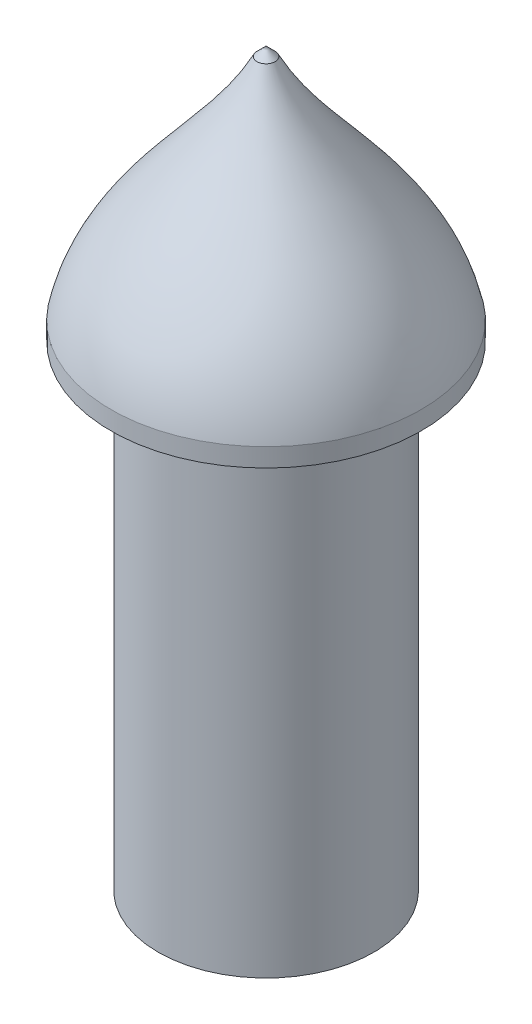
ISO-10303-21;
HEADER;
FILE_DESCRIPTION(('STEP AP214'),'2;1');
FILE_NAME('part.step','',(''),(''),'','','');
FILE_SCHEMA(('AUTOMOTIVE_DESIGN { 1 0 10303 214 1 1 1 1 }'));
ENDSEC;
DATA;
#1=APPLICATION_CONTEXT('core data for automotive mechanical design processes');
#2=APPLICATION_PROTOCOL_DEFINITION('international standard','automotive_design',2000,#1);
#3=PRODUCT_CONTEXT('',#1,'mechanical');
#4=PRODUCT('Part','Part','',(#3));
#5=PRODUCT_RELATED_PRODUCT_CATEGORY('part','',(#4));
#6=PRODUCT_DEFINITION_FORMATION('','',#4);
#7=PRODUCT_DEFINITION_CONTEXT('part definition',#1,'design');
#8=PRODUCT_DEFINITION('design','',#6,#7);
#9=PRODUCT_DEFINITION_SHAPE('','',#8);
#10=(LENGTH_UNIT() NAMED_UNIT(*) SI_UNIT(.MILLI.,.METRE.));
#11=(NAMED_UNIT(*) PLANE_ANGLE_UNIT() SI_UNIT($,.RADIAN.));
#12=(NAMED_UNIT(*) SI_UNIT($,.STERADIAN.) SOLID_ANGLE_UNIT());
#13=UNCERTAINTY_MEASURE_WITH_UNIT(LENGTH_MEASURE(1.E-05),#10,'distance_accuracy_value','');
#14=(GEOMETRIC_REPRESENTATION_CONTEXT(3) GLOBAL_UNCERTAINTY_ASSIGNED_CONTEXT((#13)) GLOBAL_UNIT_ASSIGNED_CONTEXT((#10,
#11,#12)) REPRESENTATION_CONTEXT('',''));
#15=CARTESIAN_POINT('',(0.,0.,0.));
#16=DIRECTION('',(0.,0.,1.));
#17=DIRECTION('',(1.,0.,0.));
#18=AXIS2_PLACEMENT_3D('',#15,#16,#17);
#19=CARTESIAN_POINT('',(-2.,0.,0.));
#20=DIRECTION('',(0.,1.,0.));
#21=DIRECTION('',(0.,0.,1.));
#22=AXIS2_PLACEMENT_3D('',#19,#20,#21);
#23=PLANE('',#22);
#24=CARTESIAN_POINT('',(0.,0.,0.));
#25=DIRECTION('',(0.,1.,0.));
#26=DIRECTION('',(0.,0.,1.));
#27=AXIS2_PLACEMENT_3D('',#24,#25,#26);
#28=CIRCLE('',#27,3.45);
#29=CARTESIAN_POINT('',(0.,0.,3.45));
#30=VERTEX_POINT('',#29);
#31=EDGE_CURVE('E11',#30,#30,#28,.T.);
#32=ORIENTED_EDGE('',*,*,#31,.T.);
#33=EDGE_LOOP('',(#32));
#34=FACE_BOUND('',#33,.T.);
#35=CARTESIAN_POINT('',(0.,0.,0.));
#36=DIRECTION('',(0.,-1.,0.));
#37=DIRECTION('',(0.,0.,-1.));
#38=AXIS2_PLACEMENT_3D('',#35,#36,#37);
#39=CIRCLE('',#38,4.24433157335061);
#40=CARTESIAN_POINT('',(0.,0.,-4.24433157335061));
#41=VERTEX_POINT('',#40);
#42=EDGE_CURVE('E57',#41,#41,#39,.T.);
#43=ORIENTED_EDGE('',*,*,#42,.T.);
#44=EDGE_LOOP('',(#43));
#45=FACE_BOUND('',#44,.T.);
#46=ADVANCED_FACE('F33',(#34,#45),#23,.F.);
#47=CARTESIAN_POINT('',(0.,7.,0.));
#48=DIRECTION('',(0.,-1.,0.));
#49=DIRECTION('',(0.,0.,-1.));
#50=AXIS2_PLACEMENT_3D('',#47,#48,#49);
#51=CONICAL_SURFACE('',#50,0.,0.785398163397438);
#52=CARTESIAN_POINT('',(0.,6.75257649370923,0.));
#53=DIRECTION('',(0.,-1.,0.));
#54=DIRECTION('',(0.,0.,-1.));
#55=AXIS2_PLACEMENT_3D('',#52,#53,#54);
#56=CIRCLE('',#55,0.247423506290761);
#57=CARTESIAN_POINT('',(0.,6.75257649370923,-0.247423506290761));
#58=VERTEX_POINT('',#57);
#59=EDGE_CURVE('E107',#58,#58,#56,.T.);
#60=ORIENTED_EDGE('',*,*,#59,.F.);
#61=EDGE_LOOP('',(#60));
#62=FACE_BOUND('',#61,.T.);
#63=CARTESIAN_POINT('',(0.,7.,0.));
#64=VERTEX_POINT('',#63);
#65=VERTEX_LOOP('',#64);
#66=FACE_BOUND('',#65,.T.);
#67=ADVANCED_FACE('F97',(#62,#66),#51,.T.);
#68=CARTESIAN_POINT('',(-0.247423506290761,6.75257649370924,0.));
#69=CARTESIAN_POINT('',(-1.37731233628629,4.51509097975712,0.));
#70=CARTESIAN_POINT('',(-3.6972749551022,3.08189891885917,0.));
#71=CARTESIAN_POINT('',(-4.24433157335061,0.506327417075365,0.));
#72=B_SPLINE_CURVE_WITH_KNOTS('',3,(#68,#69,#70,#71),.UNSPECIFIED.,.F.,.F.,(4,4),(0.,1.),.UNSPECIFIED.);
#73=CARTESIAN_POINT('',(0.,-2.,0.));
#74=DIRECTION('',(0.,-1.,0.));
#75=AXIS1_PLACEMENT('',#73,#74);
#76=SURFACE_OF_REVOLUTION('',#72,#75);
#77=CARTESIAN_POINT('',(0.,0.506327417075365,0.));
#78=DIRECTION('',(0.,-1.,0.));
#79=DIRECTION('',(0.,0.,-1.));
#80=AXIS2_PLACEMENT_3D('',#77,#78,#79);
#81=CIRCLE('',#80,4.24433157335061);
#82=CARTESIAN_POINT('',(0.,0.506327417075365,-4.24433157335061));
#83=VERTEX_POINT('',#82);
#84=EDGE_CURVE('E61',#83,#83,#81,.T.);
#85=ORIENTED_EDGE('',*,*,#84,.F.);
#86=EDGE_LOOP('',(#85));
#87=FACE_BOUND('',#86,.T.);
#88=ORIENTED_EDGE('',*,*,#59,.T.);
#89=EDGE_LOOP('',(#88));
#90=FACE_BOUND('',#89,.T.);
#91=ADVANCED_FACE('F94',(#87,#90),#76,.T.);
#92=CARTESIAN_POINT('',(0.,-2.,0.));
#93=DIRECTION('',(0.,-1.,0.));
#94=DIRECTION('',(0.,0.,-1.));
#95=AXIS2_PLACEMENT_3D('',#92,#93,#94);
#96=CYLINDRICAL_SURFACE('',#95,4.24433157335061);
#97=ORIENTED_EDGE('',*,*,#42,.F.);
#98=EDGE_LOOP('',(#97));
#99=FACE_BOUND('',#98,.T.);
#100=ORIENTED_EDGE('',*,*,#84,.T.);
#101=EDGE_LOOP('',(#100));
#102=FACE_BOUND('',#101,.T.);
#103=ADVANCED_FACE('F90',(#99,#102),#96,.T.);
#104=CARTESIAN_POINT('',(0.,-13.,0.));
#105=DIRECTION('',(0.,-1.,0.));
#106=DIRECTION('',(0.,0.,-1.));
#107=AXIS2_PLACEMENT_3D('',#104,#105,#106);
#108=PLANE('',#107);
#109=CARTESIAN_POINT('',(0.,-13.,0.));
#110=DIRECTION('',(0.,-1.,0.));
#111=DIRECTION('',(0.,0.,-1.));
#112=AXIS2_PLACEMENT_3D('',#109,#110,#111);
#113=CIRCLE('',#112,2.95);
#114=CARTESIAN_POINT('',(0.,-13.,2.95));
#115=VERTEX_POINT('',#114);
#116=EDGE_CURVE('E64',#115,#115,#113,.T.);
#117=ORIENTED_EDGE('',*,*,#116,.T.);
#118=EDGE_LOOP('',(#117));
#119=FACE_BOUND('',#118,.T.);
#120=CARTESIAN_POINT('',(0.,-13.,0.));
#121=DIRECTION('',(0.,-1.,0.));
#122=DIRECTION('',(0.,0.,-1.));
#123=AXIS2_PLACEMENT_3D('',#120,#121,#122);
#124=CIRCLE('',#123,2.1);
#125=CARTESIAN_POINT('',(0.,-13.,2.1));
#126=VERTEX_POINT('',#125);
#127=EDGE_CURVE('E207',#126,#126,#124,.T.);
#128=ORIENTED_EDGE('',*,*,#127,.F.);
#129=EDGE_LOOP('',(#128));
#130=FACE_BOUND('',#129,.T.);
#131=ADVANCED_FACE('F93',(#119,#130),#108,.T.);
#132=CARTESIAN_POINT('',(0.,-13.,0.));
#133=DIRECTION('',(0.,1.,0.));
#134=DIRECTION('',(0.,0.,1.));
#135=AXIS2_PLACEMENT_3D('',#132,#133,#134);
#136=CYLINDRICAL_SURFACE('',#135,2.95);
#137=CARTESIAN_POINT('',(0.,-0.5,0.));
#138=DIRECTION('',(0.,1.,0.));
#139=DIRECTION('',(0.,0.,1.));
#140=AXIS2_PLACEMENT_3D('',#137,#138,#139);
#141=CIRCLE('',#140,2.95);
#142=CARTESIAN_POINT('',(0.,-0.5,2.95));
#143=VERTEX_POINT('',#142);
#144=EDGE_CURVE('E41',#143,#143,#141,.F.);
#145=CARTESIAN_POINT('',(0.,-0.5,2.95));
#146=CARTESIAN_POINT('',(0.,-0.630208333333334,2.95));
#147=CARTESIAN_POINT('',(0.,-0.760416666666667,2.95));
#148=CARTESIAN_POINT('',(0.,-1.02083333333333,2.95));
#149=CARTESIAN_POINT('',(0.,-1.15104166666667,2.95));
#150=CARTESIAN_POINT('',(0.,-1.41145833333333,2.95));
#151=CARTESIAN_POINT('',(0.,-1.54166666666667,2.95));
#152=CARTESIAN_POINT('',(0.,-1.80208333333333,2.95));
#153=CARTESIAN_POINT('',(0.,-1.93229166666667,2.95));
#154=CARTESIAN_POINT('',(0.,-2.19270833333333,2.95));
#155=CARTESIAN_POINT('',(0.,-2.32291666666667,2.95));
#156=CARTESIAN_POINT('',(0.,-2.58333333333333,2.95));
#157=CARTESIAN_POINT('',(0.,-2.71354166666667,2.95));
#158=CARTESIAN_POINT('',(0.,-2.97395833333333,2.95));
#159=CARTESIAN_POINT('',(0.,-3.10416666666667,2.95));
#160=CARTESIAN_POINT('',(0.,-3.36458333333333,2.95));
#161=CARTESIAN_POINT('',(0.,-3.49479166666667,2.95));
#162=CARTESIAN_POINT('',(0.,-3.75520833333333,2.95));
#163=CARTESIAN_POINT('',(0.,-3.88541666666667,2.95));
#164=CARTESIAN_POINT('',(0.,-4.14583333333333,2.95));
#165=CARTESIAN_POINT('',(0.,-4.27604166666667,2.95));
#166=CARTESIAN_POINT('',(0.,-4.53645833333333,2.95));
#167=CARTESIAN_POINT('',(0.,-4.66666666666667,2.95));
#168=CARTESIAN_POINT('',(0.,-4.92708333333333,2.95));
#169=CARTESIAN_POINT('',(0.,-5.05729166666667,2.95));
#170=CARTESIAN_POINT('',(0.,-5.31770833333333,2.95));
#171=CARTESIAN_POINT('',(0.,-5.44791666666667,2.95));
#172=CARTESIAN_POINT('',(0.,-5.70833333333333,2.95));
#173=CARTESIAN_POINT('',(0.,-5.83854166666667,2.95));
#174=CARTESIAN_POINT('',(0.,-6.09895833333333,2.95));
#175=CARTESIAN_POINT('',(0.,-6.22916666666667,2.95));
#176=CARTESIAN_POINT('',(0.,-6.48958333333333,2.95));
#177=CARTESIAN_POINT('',(0.,-6.61979166666667,2.95));
#178=CARTESIAN_POINT('',(0.,-6.88020833333333,2.95));
#179=CARTESIAN_POINT('',(0.,-7.01041666666667,2.95));
#180=CARTESIAN_POINT('',(0.,-7.27083333333333,2.95));
#181=CARTESIAN_POINT('',(0.,-7.40104166666667,2.95));
#182=CARTESIAN_POINT('',(0.,-7.66145833333333,2.95));
#183=CARTESIAN_POINT('',(0.,-7.79166666666667,2.95));
#184=CARTESIAN_POINT('',(0.,-8.05208333333333,2.95));
#185=CARTESIAN_POINT('',(0.,-8.18229166666667,2.95));
#186=CARTESIAN_POINT('',(0.,-8.44270833333333,2.95));
#187=CARTESIAN_POINT('',(0.,-8.57291666666667,2.95));
#188=CARTESIAN_POINT('',(0.,-8.83333333333333,2.95));
#189=CARTESIAN_POINT('',(0.,-8.96354166666667,2.95));
#190=CARTESIAN_POINT('',(0.,-9.22395833333333,2.95));
#191=CARTESIAN_POINT('',(0.,-9.35416666666667,2.95));
#192=CARTESIAN_POINT('',(0.,-9.61458333333333,2.95));
#193=CARTESIAN_POINT('',(0.,-9.74479166666667,2.95));
#194=CARTESIAN_POINT('',(0.,-10.0052083333333,2.95));
#195=CARTESIAN_POINT('',(0.,-10.1354166666667,2.95));
#196=CARTESIAN_POINT('',(0.,-10.3958333333333,2.95));
#197=CARTESIAN_POINT('',(0.,-10.5260416666667,2.95));
#198=CARTESIAN_POINT('',(0.,-10.7864583333333,2.95));
#199=CARTESIAN_POINT('',(0.,-10.9166666666667,2.95));
#200=CARTESIAN_POINT('',(0.,-11.1770833333333,2.95));
#201=CARTESIAN_POINT('',(0.,-11.3072916666667,2.95));
#202=CARTESIAN_POINT('',(0.,-11.5677083333333,2.95));
#203=CARTESIAN_POINT('',(0.,-11.6979166666667,2.95));
#204=CARTESIAN_POINT('',(0.,-11.9583333333333,2.95));
#205=CARTESIAN_POINT('',(0.,-12.0885416666667,2.95));
#206=CARTESIAN_POINT('',(0.,-12.3489583333333,2.95));
#207=CARTESIAN_POINT('',(0.,-12.4791666666667,2.95));
#208=CARTESIAN_POINT('',(0.,-12.7395833333333,2.95));
#209=CARTESIAN_POINT('',(0.,-12.8697916666667,2.95));
#210=CARTESIAN_POINT('',(0.,-13.,2.95));
#211=B_SPLINE_CURVE_WITH_KNOTS('',3,(#145,#146,#147,#148,#149,#150,#151,#152,#153,#154,#155,
#156,#157,#158,#159,#160,#161,#162,#163,#164,#165,#166,#167,#168,#169,#170,#171,#172,#173,#174,
#175,#176,#177,#178,#179,#180,#181,#182,#183,#184,#185,#186,#187,#188,#189,#190,#191,#192,#193,
#194,#195,#196,#197,#198,#199,#200,#201,#202,#203,#204,#205,#206,#207,#208,#209,#210),
.UNSPECIFIED.,.F.,.F.,(4,2,2,2,2,2,2,2,2,2,2,2,2,2,2,2,2,2,2,2,2,2,2,2,2,2,2,2,2,2,2,2,4),(0.,
0.390625,0.781250000000001,1.171875,1.5625,1.953125,2.34375,2.734375,3.125,3.515625,3.90625,
4.296875,4.6875,5.078125,5.46875,5.859375,6.25,6.640625,7.03125,7.421875,7.8125,8.203125,
8.59375,8.984375,9.375,9.765625,10.15625,10.546875,10.9375,11.328125,11.71875,12.109375,12.5),.UNSPECIFIED.);
#212=EDGE_CURVE('BSEAM117',#143,#115,#211,.T.);
#213=ORIENTED_EDGE('',*,*,#144,.T.);
#214=ORIENTED_EDGE('',*,*,#116,.F.);
#215=ORIENTED_EDGE('',*,*,#212,.T.);
#216=ORIENTED_EDGE('',*,*,#212,.F.);
#217=EDGE_LOOP('',(#213,#215,#214,#216));
#218=FACE_BOUND('',#217,.T.);
#219=ADVANCED_FACE('F117',(#218),#136,.T.);
#220=CARTESIAN_POINT('',(0.,-13.,0.));
#221=DIRECTION('',(0.,1.,0.));
#222=DIRECTION('',(0.,0.,1.));
#223=AXIS2_PLACEMENT_3D('',#220,#221,#222);
#224=CYLINDRICAL_SURFACE('',#223,2.1);
#225=CARTESIAN_POINT('',(0.,0.,0.));
#226=DIRECTION('',(0.,-1.,0.));
#227=DIRECTION('',(0.,0.,-1.));
#228=AXIS2_PLACEMENT_3D('',#225,#226,#227);
#229=CIRCLE('',#228,2.1);
#230=CARTESIAN_POINT('',(0.,0.,2.1));
#231=VERTEX_POINT('',#230);
#232=EDGE_CURVE('E208',#231,#231,#229,.T.);
#233=CARTESIAN_POINT('',(0.,-13.,2.1));
#234=CARTESIAN_POINT('',(0.,-12.8645833333333,2.1));
#235=CARTESIAN_POINT('',(0.,-12.7291666666667,2.1));
#236=CARTESIAN_POINT('',(0.,-12.4583333333333,2.1));
#237=CARTESIAN_POINT('',(0.,-12.3229166666667,2.1));
#238=CARTESIAN_POINT('',(0.,-12.0520833333333,2.1));
#239=CARTESIAN_POINT('',(0.,-11.9166666666667,2.1));
#240=CARTESIAN_POINT('',(0.,-11.6458333333333,2.1));
#241=CARTESIAN_POINT('',(0.,-11.5104166666667,2.1));
#242=CARTESIAN_POINT('',(0.,-11.2395833333333,2.1));
#243=CARTESIAN_POINT('',(0.,-11.1041666666667,2.1));
#244=CARTESIAN_POINT('',(0.,-10.8333333333333,2.1));
#245=CARTESIAN_POINT('',(0.,-10.6979166666667,2.1));
#246=CARTESIAN_POINT('',(0.,-10.4270833333333,2.1));
#247=CARTESIAN_POINT('',(0.,-10.2916666666667,2.1));
#248=CARTESIAN_POINT('',(0.,-10.0208333333333,2.1));
#249=CARTESIAN_POINT('',(0.,-9.88541666666667,2.1));
#250=CARTESIAN_POINT('',(0.,-9.61458333333333,2.1));
#251=CARTESIAN_POINT('',(0.,-9.47916666666667,2.1));
#252=CARTESIAN_POINT('',(0.,-9.20833333333333,2.1));
#253=CARTESIAN_POINT('',(0.,-9.07291666666666,2.1));
#254=CARTESIAN_POINT('',(0.,-8.80208333333333,2.1));
#255=CARTESIAN_POINT('',(0.,-8.66666666666667,2.1));
#256=CARTESIAN_POINT('',(0.,-8.39583333333333,2.1));
#257=CARTESIAN_POINT('',(0.,-8.26041666666667,2.1));
#258=CARTESIAN_POINT('',(0.,-7.98958333333333,2.1));
#259=CARTESIAN_POINT('',(0.,-7.85416666666667,2.1));
#260=CARTESIAN_POINT('',(0.,-7.58333333333333,2.1));
#261=CARTESIAN_POINT('',(0.,-7.44791666666667,2.1));
#262=CARTESIAN_POINT('',(0.,-7.17708333333333,2.1));
#263=CARTESIAN_POINT('',(0.,-7.04166666666667,2.1));
#264=CARTESIAN_POINT('',(0.,-6.77083333333333,2.1));
#265=CARTESIAN_POINT('',(0.,-6.63541666666667,2.1));
#266=CARTESIAN_POINT('',(0.,-6.36458333333333,2.1));
#267=CARTESIAN_POINT('',(0.,-6.22916666666667,2.1));
#268=CARTESIAN_POINT('',(0.,-5.95833333333333,2.1));
#269=CARTESIAN_POINT('',(0.,-5.82291666666667,2.1));
#270=CARTESIAN_POINT('',(0.,-5.55208333333333,2.1));
#271=CARTESIAN_POINT('',(0.,-5.41666666666667,2.1));
#272=CARTESIAN_POINT('',(0.,-5.14583333333333,2.1));
#273=CARTESIAN_POINT('',(0.,-5.01041666666667,2.1));
#274=CARTESIAN_POINT('',(0.,-4.73958333333333,2.1));
#275=CARTESIAN_POINT('',(0.,-4.60416666666667,2.1));
#276=CARTESIAN_POINT('',(0.,-4.33333333333333,2.1));
#277=CARTESIAN_POINT('',(0.,-4.19791666666667,2.1));
#278=CARTESIAN_POINT('',(0.,-3.92708333333333,2.1));
#279=CARTESIAN_POINT('',(0.,-3.79166666666667,2.1));
#280=CARTESIAN_POINT('',(0.,-3.52083333333333,2.1));
#281=CARTESIAN_POINT('',(0.,-3.38541666666667,2.1));
#282=CARTESIAN_POINT('',(0.,-3.11458333333333,2.1));
#283=CARTESIAN_POINT('',(0.,-2.97916666666667,2.1));
#284=CARTESIAN_POINT('',(0.,-2.70833333333333,2.1));
#285=CARTESIAN_POINT('',(0.,-2.57291666666667,2.1));
#286=CARTESIAN_POINT('',(0.,-2.30208333333333,2.1));
#287=CARTESIAN_POINT('',(0.,-2.16666666666667,2.1));
#288=CARTESIAN_POINT('',(0.,-1.89583333333333,2.1));
#289=CARTESIAN_POINT('',(0.,-1.76041666666667,2.1));
#290=CARTESIAN_POINT('',(0.,-1.48958333333333,2.1));
#291=CARTESIAN_POINT('',(0.,-1.35416666666667,2.1));
#292=CARTESIAN_POINT('',(0.,-1.08333333333333,2.1));
#293=CARTESIAN_POINT('',(0.,-0.947916666666667,2.1));
#294=CARTESIAN_POINT('',(0.,-0.677083333333334,2.1));
#295=CARTESIAN_POINT('',(0.,-0.541666666666667,2.1));
#296=CARTESIAN_POINT('',(0.,-0.270833333333334,2.1));
#297=CARTESIAN_POINT('',(0.,-0.135416666666667,2.1));
#298=CARTESIAN_POINT('',(0.,0.,2.1));
#299=B_SPLINE_CURVE_WITH_KNOTS('',3,(#233,#234,#235,#236,#237,#238,#239,#240,#241,#242,#243,
#244,#245,#246,#247,#248,#249,#250,#251,#252,#253,#254,#255,#256,#257,#258,#259,#260,#261,#262,
#263,#264,#265,#266,#267,#268,#269,#270,#271,#272,#273,#274,#275,#276,#277,#278,#279,#280,#281,
#282,#283,#284,#285,#286,#287,#288,#289,#290,#291,#292,#293,#294,#295,#296,#297,#298),
.UNSPECIFIED.,.F.,.F.,(4,2,2,2,2,2,2,2,2,2,2,2,2,2,2,2,2,2,2,2,2,2,2,2,2,2,2,2,2,2,2,2,4),(0.,
0.40625,0.812500000000001,1.21875,1.625,2.03125,2.4375,2.84375,3.25,3.65625,4.0625,4.46875,
4.875,5.28125,5.6875,6.09375,6.5,6.90625,7.3125,7.71875,8.125,8.53125,8.9375,9.34375,9.75,
10.15625,10.5625,10.96875,11.375,11.78125,12.1875,12.59375,13.),.UNSPECIFIED.);
#300=EDGE_CURVE('BSEAM51',#126,#231,#299,.T.);
#301=ORIENTED_EDGE('',*,*,#127,.T.);
#302=ORIENTED_EDGE('',*,*,#232,.F.);
#303=ORIENTED_EDGE('',*,*,#300,.T.);
#304=ORIENTED_EDGE('',*,*,#300,.F.);
#305=EDGE_LOOP('',(#301,#303,#302,#304));
#306=FACE_BOUND('',#305,.T.);
#307=ADVANCED_FACE('F51',(#306),#224,.F.);
#308=CARTESIAN_POINT('',(-1.69028776226972,4.67981817800798,0.));
#309=CARTESIAN_POINT('',(-2.74571758477646,3.4129348677315,0.));
#310=CARTESIAN_POINT('',(-3.88260220590787,2.20936841697556,0.));
#311=CARTESIAN_POINT('',(-4.24433157335061,0.506327417075365,0.));
#312=B_SPLINE_CURVE_WITH_KNOTS('',3,(#308,#309,#310,#311),.UNSPECIFIED.,.F.,.F.,(4,4),
(0.338771609050382,1.),.UNSPECIFIED.);
#313=CARTESIAN_POINT('',(0.,-2.,0.));
#314=DIRECTION('',(0.,-1.,0.));
#315=AXIS1_PLACEMENT('',#313,#314);
#316=SURFACE_OF_REVOLUTION('',#312,#315);
#317=OFFSET_SURFACE('',#316,-2.2,.F.);
#318=CARTESIAN_POINT('',(0.,3.27165367031679,0.));
#319=VERTEX_POINT('',#318);
#320=VERTEX_LOOP('',#319);
#321=FACE_BOUND('',#320,.T.);
#322=CARTESIAN_POINT('',(0.,0.243879977191898,0.));
#323=DIRECTION('',(0.,-1.,0.));
#324=DIRECTION('',(0.,0.,-1.));
#325=AXIS2_PLACEMENT_3D('',#322,#323,#324);
#326=CIRCLE('',#325,2.0443315733506);
#327=CARTESIAN_POINT('',(0.,0.243879977191898,-2.0443315733506));
#328=VERTEX_POINT('',#327);
#329=EDGE_CURVE('E55',#328,#328,#326,.T.);
#330=ORIENTED_EDGE('',*,*,#329,.T.);
#331=EDGE_LOOP('',(#330));
#332=FACE_BOUND('',#331,.T.);
#333=ADVANCED_FACE('F47',(#321,#332),#317,.F.);
#334=CARTESIAN_POINT('',(0.,-2.,0.));
#335=DIRECTION('',(0.,-1.,0.));
#336=DIRECTION('',(0.,0.,-1.));
#337=AXIS2_PLACEMENT_3D('',#334,#335,#336);
#338=CYLINDRICAL_SURFACE('',#337,2.04433157335061);
#339=CARTESIAN_POINT('',(0.,0.,0.));
#340=DIRECTION('',(0.,1.,0.));
#341=DIRECTION('',(0.,0.,1.));
#342=AXIS2_PLACEMENT_3D('',#339,#340,#341);
#343=CIRCLE('',#342,2.04433157335061);
#344=CARTESIAN_POINT('',(0.,0.,2.04433157335061));
#345=VERTEX_POINT('',#344);
#346=EDGE_CURVE('E58',#345,#345,#343,.F.);
#347=ORIENTED_EDGE('',*,*,#346,.T.);
#348=EDGE_LOOP('',(#347));
#349=FACE_BOUND('',#348,.T.);
#350=ORIENTED_EDGE('',*,*,#329,.F.);
#351=EDGE_LOOP('',(#350));
#352=FACE_BOUND('',#351,.T.);
#353=ADVANCED_FACE('F50',(#349,#352),#338,.F.);
#354=ORIENTED_EDGE('',*,*,#232,.T.);
#355=EDGE_LOOP('',(#354));
#356=FACE_BOUND('',#355,.T.);
#357=ORIENTED_EDGE('',*,*,#346,.F.);
#358=EDGE_LOOP('',(#357));
#359=FACE_BOUND('',#358,.T.);
#360=ADVANCED_FACE('F85',(#356,#359),#23,.F.);
#361=CARTESIAN_POINT('',(0.,-0.5,0.));
#362=DIRECTION('',(0.,1.,0.));
#363=DIRECTION('',(0.,0.,1.));
#364=AXIS2_PLACEMENT_3D('',#361,#362,#363);
#365=TOROIDAL_SURFACE('',#364,3.45,0.5);
#366=ORIENTED_EDGE('',*,*,#31,.F.);
#367=EDGE_LOOP('',(#366));
#368=FACE_BOUND('',#367,.T.);
#369=ORIENTED_EDGE('',*,*,#144,.F.);
#370=EDGE_LOOP('',(#369));
#371=FACE_BOUND('',#370,.T.);
#372=ADVANCED_FACE('F35',(#368,#371),#365,.F.);
#373=CLOSED_SHELL('',(#46,#67,#91,#103,#131,#219,#307,#333,#353,#360,#372));
#374=MANIFOLD_SOLID_BREP('B2',#373);
#375=ADVANCED_BREP_SHAPE_REPRESENTATION('',(#18,#374),#14);
#376=SHAPE_DEFINITION_REPRESENTATION(#9,#375);
ENDSEC;
END-ISO-10303-21;
